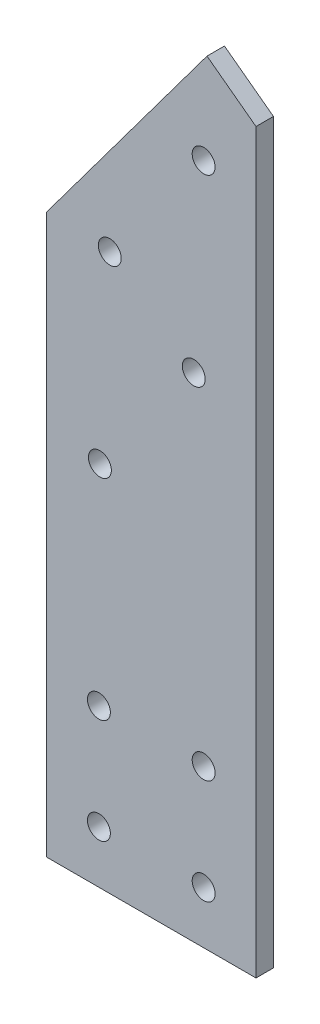
ISO-10303-21;
HEADER;
FILE_DESCRIPTION(('STEP AP214'),'2;1');
FILE_NAME('part.step','',(''),(''),'','','');
FILE_SCHEMA(('AUTOMOTIVE_DESIGN { 1 0 10303 214 1 1 1 1 }'));
ENDSEC;
DATA;
#1=APPLICATION_CONTEXT('core data for automotive mechanical design processes');
#2=APPLICATION_PROTOCOL_DEFINITION('international standard','automotive_design',2000,#1);
#3=PRODUCT_CONTEXT('',#1,'mechanical');
#4=PRODUCT('Part','Part','',(#3));
#5=PRODUCT_RELATED_PRODUCT_CATEGORY('part','',(#4));
#6=PRODUCT_DEFINITION_FORMATION('','',#4);
#7=PRODUCT_DEFINITION_CONTEXT('part definition',#1,'design');
#8=PRODUCT_DEFINITION('design','',#6,#7);
#9=PRODUCT_DEFINITION_SHAPE('','',#8);
#10=(LENGTH_UNIT() NAMED_UNIT(*) SI_UNIT(.MILLI.,.METRE.));
#11=(NAMED_UNIT(*) PLANE_ANGLE_UNIT() SI_UNIT($,.RADIAN.));
#12=(NAMED_UNIT(*) SI_UNIT($,.STERADIAN.) SOLID_ANGLE_UNIT());
#13=UNCERTAINTY_MEASURE_WITH_UNIT(LENGTH_MEASURE(1.E-05),#10,'distance_accuracy_value','');
#14=(GEOMETRIC_REPRESENTATION_CONTEXT(3) GLOBAL_UNCERTAINTY_ASSIGNED_CONTEXT((#13)) GLOBAL_UNIT_ASSIGNED_CONTEXT((#10,
#11,#12)) REPRESENTATION_CONTEXT('',''));
#15=CARTESIAN_POINT('',(0.,0.,0.));
#16=DIRECTION('',(0.,0.,1.));
#17=DIRECTION('',(1.,0.,0.));
#18=AXIS2_PLACEMENT_3D('',#15,#16,#17);
#19=CARTESIAN_POINT('',(0.,0.,0.));
#20=DIRECTION('',(0.,0.,-1.));
#21=DIRECTION('',(-1.,0.,0.));
#22=AXIS2_PLACEMENT_3D('',#19,#20,#21);
#23=PLANE('',#22);
#24=CARTESIAN_POINT('',(19.05,57.15,0.));
#25=DIRECTION('',(0.,0.,1.));
#26=DIRECTION('',(1.,0.,0.));
#27=AXIS2_PLACEMENT_3D('',#24,#25,#26);
#28=CIRCLE('',#27,4.167251);
#29=CARTESIAN_POINT('',(23.217251,57.15,0.));
#30=VERTEX_POINT('',#29);
#31=EDGE_CURVE('E53',#30,#30,#28,.T.);
#32=ORIENTED_EDGE('',*,*,#31,.T.);
#33=EDGE_LOOP('',(#32));
#34=FACE_BOUND('',#33,.T.);
#35=CARTESIAN_POINT('',(57.15,57.15,0.));
#36=DIRECTION('',(0.,0.,1.));
#37=DIRECTION('',(1.,0.,0.));
#38=AXIS2_PLACEMENT_3D('',#35,#36,#37);
#39=CIRCLE('',#38,4.167251);
#40=CARTESIAN_POINT('',(61.317251,57.15,0.));
#41=VERTEX_POINT('',#40);
#42=EDGE_CURVE('E151',#41,#41,#39,.T.);
#43=ORIENTED_EDGE('',*,*,#42,.T.);
#44=EDGE_LOOP('',(#43));
#45=FACE_BOUND('',#44,.T.);
#46=DIRECTION('',(0.,-1.,0.));
#47=VECTOR('',#46,1.);
#48=CARTESIAN_POINT('',(0.,0.,0.));
#49=LINE('',#48,#47);
#50=CARTESIAN_POINT('',(0.,203.2,0.));
#51=VERTEX_POINT('',#50);
#52=CARTESIAN_POINT('',(0.,0.,0.));
#53=VERTEX_POINT('',#52);
#54=EDGE_CURVE('E127',#51,#53,#49,.T.);
#55=ORIENTED_EDGE('',*,*,#54,.F.);
#56=DIRECTION('',(-0.597485201625335,-0.801879937296559,0.));
#57=VECTOR('',#56,1.);
#58=CARTESIAN_POINT('',(0.,203.2,0.));
#59=LINE('',#58,#57);
#60=CARTESIAN_POINT('',(58.3782183935839,281.54892308226,0.));
#61=VERTEX_POINT('',#60);
#62=EDGE_CURVE('E87',#61,#51,#59,.T.);
#63=ORIENTED_EDGE('',*,*,#62,.F.);
#64=DIRECTION('',(-0.801879937296559,0.597485201625334,0.));
#65=VECTOR('',#64,1.);
#66=CARTESIAN_POINT('',(58.3782183935839,281.54892308226,0.));
#67=LINE('',#66,#65);
#68=CARTESIAN_POINT('',(76.2,268.269814476137,0.));
#69=VERTEX_POINT('',#68);
#70=EDGE_CURVE('E81',#69,#61,#67,.T.);
#71=ORIENTED_EDGE('',*,*,#70,.F.);
#72=DIRECTION('',(0.,1.,0.));
#73=VECTOR('',#72,1.);
#74=CARTESIAN_POINT('',(76.2,268.269814476137,0.));
#75=LINE('',#74,#73);
#76=CARTESIAN_POINT('',(76.2,0.,0.));
#77=VERTEX_POINT('',#76);
#78=EDGE_CURVE('E113',#77,#69,#75,.T.);
#79=ORIENTED_EDGE('',*,*,#78,.F.);
#80=DIRECTION('',(1.,0.,0.));
#81=VECTOR('',#80,1.);
#82=CARTESIAN_POINT('',(0.,0.,0.));
#83=LINE('',#82,#81);
#84=EDGE_CURVE('E131',#53,#77,#83,.T.);
#85=ORIENTED_EDGE('',*,*,#84,.F.);
#86=EDGE_LOOP('',(#55,#63,#71,#79,#85));
#87=FACE_BOUND('',#86,.T.);
#88=CARTESIAN_POINT('',(57.15,19.05,0.));
#89=DIRECTION('',(0.,0.,1.));
#90=DIRECTION('',(1.,0.,0.));
#91=AXIS2_PLACEMENT_3D('',#88,#89,#90);
#92=CIRCLE('',#91,4.167251);
#93=CARTESIAN_POINT('',(61.317251,19.05,0.));
#94=VERTEX_POINT('',#93);
#95=EDGE_CURVE('E132',#94,#94,#92,.T.);
#96=ORIENTED_EDGE('',*,*,#95,.T.);
#97=EDGE_LOOP('',(#96));
#98=FACE_BOUND('',#97,.T.);
#99=CARTESIAN_POINT('',(19.05,19.05,0.));
#100=DIRECTION('',(0.,0.,1.));
#101=DIRECTION('',(1.,0.,0.));
#102=AXIS2_PLACEMENT_3D('',#99,#100,#101);
#103=CIRCLE('',#102,4.167251);
#104=CARTESIAN_POINT('',(23.217251,19.05,0.));
#105=VERTEX_POINT('',#104);
#106=EDGE_CURVE('E216',#105,#105,#103,.T.);
#107=ORIENTED_EDGE('',*,*,#106,.T.);
#108=EDGE_LOOP('',(#107));
#109=FACE_BOUND('',#108,.T.);
#110=CARTESIAN_POINT('',(57.15,248.016906500204,0.));
#111=DIRECTION('',(0.,0.,1.));
#112=DIRECTION('',(1.,0.,0.));
#113=AXIS2_PLACEMENT_3D('',#110,#111,#112);
#114=CIRCLE('',#113,4.167251);
#115=CARTESIAN_POINT('',(61.317251,248.016906500204,0.));
#116=VERTEX_POINT('',#115);
#117=EDGE_CURVE('E220',#116,#116,#114,.T.);
#118=ORIENTED_EDGE('',*,*,#117,.T.);
#119=EDGE_LOOP('',(#118));
#120=FACE_BOUND('',#119,.T.);
#121=CARTESIAN_POINT('',(23.0037207271121,202.189468083706,0.));
#122=DIRECTION('',(0.,0.,1.));
#123=DIRECTION('',(1.,0.,0.));
#124=AXIS2_PLACEMENT_3D('',#121,#122,#123);
#125=CIRCLE('',#124,4.167251);
#126=CARTESIAN_POINT('',(27.1709717271121,202.189468083706,0.));
#127=VERTEX_POINT('',#126);
#128=EDGE_CURVE('E224',#127,#127,#125,.T.);
#129=ORIENTED_EDGE('',*,*,#128,.T.);
#130=EDGE_LOOP('',(#129));
#131=FACE_BOUND('',#130,.T.);
#132=CARTESIAN_POINT('',(53.555346338111,179.425281901781,0.));
#133=DIRECTION('',(0.,0.,1.));
#134=DIRECTION('',(1.,0.,0.));
#135=AXIS2_PLACEMENT_3D('',#132,#133,#134);
#136=CIRCLE('',#135,4.167251);
#137=CARTESIAN_POINT('',(57.722597338111,179.425281901781,0.));
#138=VERTEX_POINT('',#137);
#139=EDGE_CURVE('E228',#138,#138,#136,.T.);
#140=ORIENTED_EDGE('',*,*,#139,.T.);
#141=EDGE_LOOP('',(#140));
#142=FACE_BOUND('',#141,.T.);
#143=CARTESIAN_POINT('',(19.4090670652231,133.597843485282,0.));
#144=DIRECTION('',(0.,0.,1.));
#145=DIRECTION('',(1.,0.,0.));
#146=AXIS2_PLACEMENT_3D('',#143,#144,#145);
#147=CIRCLE('',#146,4.167251);
#148=CARTESIAN_POINT('',(23.5763180652231,133.597843485282,0.));
#149=VERTEX_POINT('',#148);
#150=EDGE_CURVE('E231',#149,#149,#147,.T.);
#151=ORIENTED_EDGE('',*,*,#150,.T.);
#152=EDGE_LOOP('',(#151));
#153=FACE_BOUND('',#152,.T.);
#154=ADVANCED_FACE('F43',(#34,#45,#87,#98,#109,#120,#131,#142,#153),#23,.T.);
#155=CARTESIAN_POINT('',(19.05,57.15,6.35));
#156=DIRECTION('',(0.,0.,1.));
#157=DIRECTION('',(1.,0.,0.));
#158=AXIS2_PLACEMENT_3D('',#155,#156,#157);
#159=CYLINDRICAL_SURFACE('',#158,4.167251);
#160=ORIENTED_EDGE('',*,*,#31,.F.);
#161=EDGE_LOOP('',(#160));
#162=FACE_BOUND('',#161,.T.);
#163=CARTESIAN_POINT('',(19.05,57.15,6.35));
#164=DIRECTION('',(0.,0.,1.));
#165=DIRECTION('',(1.,0.,0.));
#166=AXIS2_PLACEMENT_3D('',#163,#164,#165);
#167=CIRCLE('',#166,4.167251);
#168=CARTESIAN_POINT('',(23.217251,57.15,6.35));
#169=VERTEX_POINT('',#168);
#170=EDGE_CURVE('E11',#169,#169,#167,.T.);
#171=ORIENTED_EDGE('',*,*,#170,.T.);
#172=EDGE_LOOP('',(#171));
#173=FACE_BOUND('',#172,.T.);
#174=ADVANCED_FACE('F45',(#162,#173),#159,.F.);
#175=CARTESIAN_POINT('',(57.15,57.15,6.35));
#176=DIRECTION('',(0.,0.,1.));
#177=DIRECTION('',(1.,0.,0.));
#178=AXIS2_PLACEMENT_3D('',#175,#176,#177);
#179=CYLINDRICAL_SURFACE('',#178,4.167251);
#180=ORIENTED_EDGE('',*,*,#42,.F.);
#181=EDGE_LOOP('',(#180));
#182=FACE_BOUND('',#181,.T.);
#183=CARTESIAN_POINT('',(57.15,57.15,6.35));
#184=DIRECTION('',(0.,0.,1.));
#185=DIRECTION('',(1.,0.,0.));
#186=AXIS2_PLACEMENT_3D('',#183,#184,#185);
#187=CIRCLE('',#186,4.167251);
#188=CARTESIAN_POINT('',(61.317251,57.15,6.35));
#189=VERTEX_POINT('',#188);
#190=EDGE_CURVE('E155',#189,#189,#187,.T.);
#191=ORIENTED_EDGE('',*,*,#190,.T.);
#192=EDGE_LOOP('',(#191));
#193=FACE_BOUND('',#192,.T.);
#194=ADVANCED_FACE('F167',(#182,#193),#179,.F.);
#195=CARTESIAN_POINT('',(0.,0.,6.35));
#196=DIRECTION('',(1.,0.,0.));
#197=DIRECTION('',(0.,0.,-1.));
#198=AXIS2_PLACEMENT_3D('',#195,#196,#197);
#199=PLANE('',#198);
#200=ORIENTED_EDGE('',*,*,#54,.T.);
#201=DIRECTION('',(0.,0.,-1.));
#202=VECTOR('',#201,1.);
#203=CARTESIAN_POINT('',(0.,0.,6.35));
#204=LINE('',#203,#202);
#205=CARTESIAN_POINT('',(0.,0.,6.35));
#206=VERTEX_POINT('',#205);
#207=EDGE_CURVE('E148',#206,#53,#204,.T.);
#208=ORIENTED_EDGE('',*,*,#207,.F.);
#209=DIRECTION('',(0.,-1.,0.));
#210=VECTOR('',#209,1.);
#211=CARTESIAN_POINT('',(0.,0.,6.35));
#212=LINE('',#211,#210);
#213=CARTESIAN_POINT('',(0.,203.2,6.35));
#214=VERTEX_POINT('',#213);
#215=EDGE_CURVE('E141',#214,#206,#212,.T.);
#216=ORIENTED_EDGE('',*,*,#215,.F.);
#217=DIRECTION('',(0.,0.,-1.));
#218=VECTOR('',#217,1.);
#219=CARTESIAN_POINT('',(0.,203.2,6.35));
#220=LINE('',#219,#218);
#221=EDGE_CURVE('E123',#214,#51,#220,.T.);
#222=ORIENTED_EDGE('',*,*,#221,.T.);
#223=EDGE_LOOP('',(#200,#208,#216,#222));
#224=FACE_BOUND('',#223,.T.);
#225=ADVANCED_FACE('F197',(#224),#199,.F.);
#226=CARTESIAN_POINT('',(0.,0.,6.35));
#227=DIRECTION('',(0.,1.,0.));
#228=DIRECTION('',(0.,0.,1.));
#229=AXIS2_PLACEMENT_3D('',#226,#227,#228);
#230=PLANE('',#229);
#231=ORIENTED_EDGE('',*,*,#84,.T.);
#232=DIRECTION('',(0.,0.,-1.));
#233=VECTOR('',#232,1.);
#234=CARTESIAN_POINT('',(76.2,0.,6.35));
#235=LINE('',#234,#233);
#236=CARTESIAN_POINT('',(76.2,0.,6.35));
#237=VERTEX_POINT('',#236);
#238=EDGE_CURVE('E115',#237,#77,#235,.T.);
#239=ORIENTED_EDGE('',*,*,#238,.F.);
#240=DIRECTION('',(1.,0.,0.));
#241=VECTOR('',#240,1.);
#242=CARTESIAN_POINT('',(0.,0.,6.35));
#243=LINE('',#242,#241);
#244=EDGE_CURVE('E96',#206,#237,#243,.T.);
#245=ORIENTED_EDGE('',*,*,#244,.F.);
#246=ORIENTED_EDGE('',*,*,#207,.T.);
#247=EDGE_LOOP('',(#231,#239,#245,#246));
#248=FACE_BOUND('',#247,.T.);
#249=ADVANCED_FACE('F194',(#248),#230,.F.);
#250=CARTESIAN_POINT('',(76.2,268.269814476137,6.35));
#251=DIRECTION('',(-1.,0.,0.));
#252=DIRECTION('',(0.,-1.,0.));
#253=AXIS2_PLACEMENT_3D('',#250,#251,#252);
#254=PLANE('',#253);
#255=ORIENTED_EDGE('',*,*,#78,.T.);
#256=DIRECTION('',(0.,0.,-1.));
#257=VECTOR('',#256,1.);
#258=CARTESIAN_POINT('',(76.2,268.269814476137,6.35));
#259=LINE('',#258,#257);
#260=CARTESIAN_POINT('',(76.2,268.269814476137,6.35));
#261=VERTEX_POINT('',#260);
#262=EDGE_CURVE('E110',#261,#69,#259,.T.);
#263=ORIENTED_EDGE('',*,*,#262,.F.);
#264=DIRECTION('',(0.,1.,0.));
#265=VECTOR('',#264,1.);
#266=CARTESIAN_POINT('',(76.2,268.269814476137,6.35));
#267=LINE('',#266,#265);
#268=EDGE_CURVE('E100',#237,#261,#267,.T.);
#269=ORIENTED_EDGE('',*,*,#268,.F.);
#270=ORIENTED_EDGE('',*,*,#238,.T.);
#271=EDGE_LOOP('',(#255,#263,#269,#270));
#272=FACE_BOUND('',#271,.T.);
#273=ADVANCED_FACE('F111',(#272),#254,.F.);
#274=CARTESIAN_POINT('',(58.3782183935839,281.54892308226,6.35));
#275=DIRECTION('',(-0.597485201625334,-0.801879937296559,0.));
#276=DIRECTION('',(0.801879937296559,-0.597485201625334,0.));
#277=AXIS2_PLACEMENT_3D('',#274,#275,#276);
#278=PLANE('',#277);
#279=ORIENTED_EDGE('',*,*,#70,.T.);
#280=DIRECTION('',(0.,0.,-1.));
#281=VECTOR('',#280,1.);
#282=CARTESIAN_POINT('',(58.3782183935839,281.54892308226,6.35));
#283=LINE('',#282,#281);
#284=CARTESIAN_POINT('',(58.3782183935839,281.54892308226,6.35));
#285=VERTEX_POINT('',#284);
#286=EDGE_CURVE('E116',#285,#61,#283,.T.);
#287=ORIENTED_EDGE('',*,*,#286,.F.);
#288=DIRECTION('',(-0.801879937296559,0.597485201625334,0.));
#289=VECTOR('',#288,1.);
#290=CARTESIAN_POINT('',(58.3782183935839,281.54892308226,6.35));
#291=LINE('',#290,#289);
#292=EDGE_CURVE('E105',#261,#285,#291,.T.);
#293=ORIENTED_EDGE('',*,*,#292,.F.);
#294=ORIENTED_EDGE('',*,*,#262,.T.);
#295=EDGE_LOOP('',(#279,#287,#293,#294));
#296=FACE_BOUND('',#295,.T.);
#297=ADVANCED_FACE('F118',(#296),#278,.F.);
#298=CARTESIAN_POINT('',(0.,203.2,6.35));
#299=DIRECTION('',(0.801879937296559,-0.597485201625335,0.));
#300=DIRECTION('',(0.597485201625335,0.801879937296559,0.));
#301=AXIS2_PLACEMENT_3D('',#298,#299,#300);
#302=PLANE('',#301);
#303=ORIENTED_EDGE('',*,*,#62,.T.);
#304=ORIENTED_EDGE('',*,*,#221,.F.);
#305=DIRECTION('',(-0.597485201625335,-0.801879937296559,0.));
#306=VECTOR('',#305,1.);
#307=CARTESIAN_POINT('',(0.,203.2,6.35));
#308=LINE('',#307,#306);
#309=EDGE_CURVE('E61',#285,#214,#308,.T.);
#310=ORIENTED_EDGE('',*,*,#309,.F.);
#311=ORIENTED_EDGE('',*,*,#286,.T.);
#312=EDGE_LOOP('',(#303,#304,#310,#311));
#313=FACE_BOUND('',#312,.T.);
#314=ADVANCED_FACE('F172',(#313),#302,.F.);
#315=CARTESIAN_POINT('',(0.,0.,6.35));
#316=DIRECTION('',(0.,0.,-1.));
#317=DIRECTION('',(-1.,0.,0.));
#318=AXIS2_PLACEMENT_3D('',#315,#316,#317);
#319=PLANE('',#318);
#320=CARTESIAN_POINT('',(19.4090670652231,133.597843485282,6.35));
#321=DIRECTION('',(0.,0.,1.));
#322=DIRECTION('',(1.,0.,0.));
#323=AXIS2_PLACEMENT_3D('',#320,#321,#322);
#324=CIRCLE('',#323,4.167251);
#325=CARTESIAN_POINT('',(23.5763180652231,133.597843485282,6.35));
#326=VERTEX_POINT('',#325);
#327=EDGE_CURVE('E235',#326,#326,#324,.T.);
#328=ORIENTED_EDGE('',*,*,#327,.F.);
#329=EDGE_LOOP('',(#328));
#330=FACE_BOUND('',#329,.T.);
#331=CARTESIAN_POINT('',(53.555346338111,179.425281901781,6.35));
#332=DIRECTION('',(0.,0.,1.));
#333=DIRECTION('',(1.,0.,0.));
#334=AXIS2_PLACEMENT_3D('',#331,#332,#333);
#335=CIRCLE('',#334,4.167251);
#336=CARTESIAN_POINT('',(57.722597338111,179.425281901781,6.35));
#337=VERTEX_POINT('',#336);
#338=EDGE_CURVE('E234',#337,#337,#335,.T.);
#339=ORIENTED_EDGE('',*,*,#338,.F.);
#340=EDGE_LOOP('',(#339));
#341=FACE_BOUND('',#340,.T.);
#342=CARTESIAN_POINT('',(23.0037207271121,202.189468083706,6.35));
#343=DIRECTION('',(0.,0.,1.));
#344=DIRECTION('',(1.,0.,0.));
#345=AXIS2_PLACEMENT_3D('',#342,#343,#344);
#346=CIRCLE('',#345,4.167251);
#347=CARTESIAN_POINT('',(27.1709717271121,202.189468083706,6.35));
#348=VERTEX_POINT('',#347);
#349=EDGE_CURVE('E247',#348,#348,#346,.T.);
#350=ORIENTED_EDGE('',*,*,#349,.F.);
#351=EDGE_LOOP('',(#350));
#352=FACE_BOUND('',#351,.T.);
#353=CARTESIAN_POINT('',(57.15,248.016906500204,6.35));
#354=DIRECTION('',(0.,0.,1.));
#355=DIRECTION('',(1.,0.,0.));
#356=AXIS2_PLACEMENT_3D('',#353,#354,#355);
#357=CIRCLE('',#356,4.167251);
#358=CARTESIAN_POINT('',(61.317251,248.016906500204,6.35));
#359=VERTEX_POINT('',#358);
#360=EDGE_CURVE('E253',#359,#359,#357,.T.);
#361=ORIENTED_EDGE('',*,*,#360,.F.);
#362=EDGE_LOOP('',(#361));
#363=FACE_BOUND('',#362,.T.);
#364=CARTESIAN_POINT('',(19.05,19.05,6.35));
#365=DIRECTION('',(0.,0.,1.));
#366=DIRECTION('',(1.,0.,0.));
#367=AXIS2_PLACEMENT_3D('',#364,#365,#366);
#368=CIRCLE('',#367,4.167251);
#369=CARTESIAN_POINT('',(23.217251,19.05,6.35));
#370=VERTEX_POINT('',#369);
#371=EDGE_CURVE('E261',#370,#370,#368,.T.);
#372=ORIENTED_EDGE('',*,*,#371,.F.);
#373=EDGE_LOOP('',(#372));
#374=FACE_BOUND('',#373,.T.);
#375=CARTESIAN_POINT('',(57.15,19.05,6.35));
#376=DIRECTION('',(0.,0.,1.));
#377=DIRECTION('',(1.,0.,0.));
#378=AXIS2_PLACEMENT_3D('',#375,#376,#377);
#379=CIRCLE('',#378,4.167251);
#380=CARTESIAN_POINT('',(61.317251,19.05,6.35));
#381=VERTEX_POINT('',#380);
#382=EDGE_CURVE('E265',#381,#381,#379,.T.);
#383=ORIENTED_EDGE('',*,*,#382,.F.);
#384=EDGE_LOOP('',(#383));
#385=FACE_BOUND('',#384,.T.);
#386=ORIENTED_EDGE('',*,*,#215,.T.);
#387=ORIENTED_EDGE('',*,*,#244,.T.);
#388=ORIENTED_EDGE('',*,*,#268,.T.);
#389=ORIENTED_EDGE('',*,*,#292,.T.);
#390=ORIENTED_EDGE('',*,*,#309,.T.);
#391=EDGE_LOOP('',(#386,#387,#388,#389,#390));
#392=FACE_BOUND('',#391,.T.);
#393=ORIENTED_EDGE('',*,*,#190,.F.);
#394=EDGE_LOOP('',(#393));
#395=FACE_BOUND('',#394,.T.);
#396=ORIENTED_EDGE('',*,*,#170,.F.);
#397=EDGE_LOOP('',(#396));
#398=FACE_BOUND('',#397,.T.);
#399=ADVANCED_FACE('F102',(#330,#341,#352,#363,#374,#385,#392,#395,#398),#319,.F.);
#400=CARTESIAN_POINT('',(57.15,19.05,6.35));
#401=DIRECTION('',(0.,0.,1.));
#402=DIRECTION('',(1.,0.,0.));
#403=AXIS2_PLACEMENT_3D('',#400,#401,#402);
#404=CYLINDRICAL_SURFACE('',#403,4.167251);
#405=ORIENTED_EDGE('',*,*,#95,.F.);
#406=EDGE_LOOP('',(#405));
#407=FACE_BOUND('',#406,.T.);
#408=ORIENTED_EDGE('',*,*,#382,.T.);
#409=EDGE_LOOP('',(#408));
#410=FACE_BOUND('',#409,.T.);
#411=ADVANCED_FACE('F171',(#407,#410),#404,.F.);
#412=CARTESIAN_POINT('',(19.05,19.05,6.35));
#413=DIRECTION('',(0.,0.,1.));
#414=DIRECTION('',(1.,0.,0.));
#415=AXIS2_PLACEMENT_3D('',#412,#413,#414);
#416=CYLINDRICAL_SURFACE('',#415,4.167251);
#417=ORIENTED_EDGE('',*,*,#106,.F.);
#418=EDGE_LOOP('',(#417));
#419=FACE_BOUND('',#418,.T.);
#420=ORIENTED_EDGE('',*,*,#371,.T.);
#421=EDGE_LOOP('',(#420));
#422=FACE_BOUND('',#421,.T.);
#423=ADVANCED_FACE('F179',(#419,#422),#416,.F.);
#424=CARTESIAN_POINT('',(57.15,248.016906500204,6.35));
#425=DIRECTION('',(0.,0.,1.));
#426=DIRECTION('',(1.,0.,0.));
#427=AXIS2_PLACEMENT_3D('',#424,#425,#426);
#428=CYLINDRICAL_SURFACE('',#427,4.167251);
#429=ORIENTED_EDGE('',*,*,#117,.F.);
#430=EDGE_LOOP('',(#429));
#431=FACE_BOUND('',#430,.T.);
#432=ORIENTED_EDGE('',*,*,#360,.T.);
#433=EDGE_LOOP('',(#432));
#434=FACE_BOUND('',#433,.T.);
#435=ADVANCED_FACE('F300',(#431,#434),#428,.F.);
#436=CARTESIAN_POINT('',(23.0037207271121,202.189468083706,6.35));
#437=DIRECTION('',(0.,0.,1.));
#438=DIRECTION('',(1.,0.,0.));
#439=AXIS2_PLACEMENT_3D('',#436,#437,#438);
#440=CYLINDRICAL_SURFACE('',#439,4.167251);
#441=ORIENTED_EDGE('',*,*,#128,.F.);
#442=EDGE_LOOP('',(#441));
#443=FACE_BOUND('',#442,.T.);
#444=ORIENTED_EDGE('',*,*,#349,.T.);
#445=EDGE_LOOP('',(#444));
#446=FACE_BOUND('',#445,.T.);
#447=ADVANCED_FACE('F306',(#443,#446),#440,.F.);
#448=CARTESIAN_POINT('',(53.555346338111,179.425281901781,6.35));
#449=DIRECTION('',(0.,0.,1.));
#450=DIRECTION('',(1.,0.,0.));
#451=AXIS2_PLACEMENT_3D('',#448,#449,#450);
#452=CYLINDRICAL_SURFACE('',#451,4.167251);
#453=ORIENTED_EDGE('',*,*,#139,.F.);
#454=EDGE_LOOP('',(#453));
#455=FACE_BOUND('',#454,.T.);
#456=ORIENTED_EDGE('',*,*,#338,.T.);
#457=EDGE_LOOP('',(#456));
#458=FACE_BOUND('',#457,.T.);
#459=ADVANCED_FACE('F312',(#455,#458),#452,.F.);
#460=CARTESIAN_POINT('',(19.4090670652231,133.597843485282,6.35));
#461=DIRECTION('',(0.,0.,1.));
#462=DIRECTION('',(1.,0.,0.));
#463=AXIS2_PLACEMENT_3D('',#460,#461,#462);
#464=CYLINDRICAL_SURFACE('',#463,4.167251);
#465=ORIENTED_EDGE('',*,*,#150,.F.);
#466=EDGE_LOOP('',(#465));
#467=FACE_BOUND('',#466,.T.);
#468=ORIENTED_EDGE('',*,*,#327,.T.);
#469=EDGE_LOOP('',(#468));
#470=FACE_BOUND('',#469,.T.);
#471=ADVANCED_FACE('F316',(#467,#470),#464,.F.);
#472=CLOSED_SHELL('',(#154,#174,#194,#225,#249,#273,#297,#314,#399,#411,#423,#435,#447,#459,#471));
#473=MANIFOLD_SOLID_BREP('B2',#472);
#474=ADVANCED_BREP_SHAPE_REPRESENTATION('',(#18,#473),#14);
#475=SHAPE_DEFINITION_REPRESENTATION(#9,#474);
ENDSEC;
END-ISO-10303-21;
